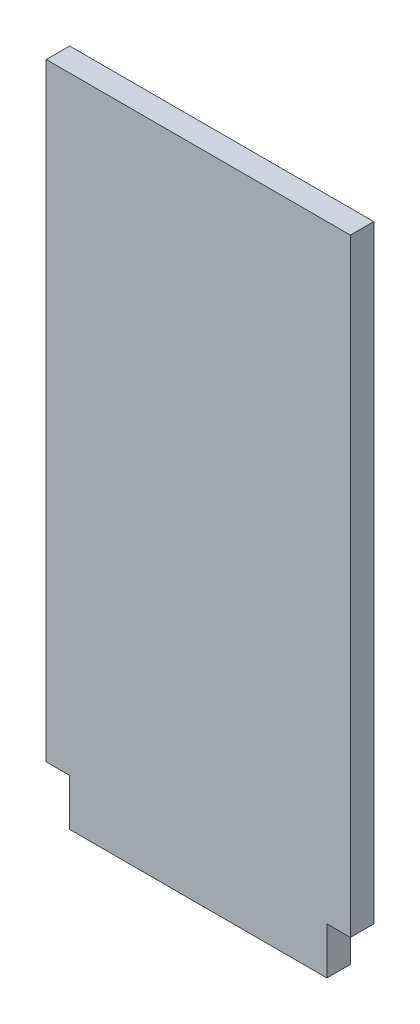
ISO-10303-21;
HEADER;
FILE_DESCRIPTION(('STEP AP214'),'2;1');
FILE_NAME('part.step','',(''),(''),'','','');
FILE_SCHEMA(('AUTOMOTIVE_DESIGN { 1 0 10303 214 1 1 1 1 }'));
ENDSEC;
DATA;
#1=APPLICATION_CONTEXT('core data for automotive mechanical design processes');
#2=APPLICATION_PROTOCOL_DEFINITION('international standard','automotive_design',2000,#1);
#3=PRODUCT_CONTEXT('',#1,'mechanical');
#4=PRODUCT('Part','Part','',(#3));
#5=PRODUCT_RELATED_PRODUCT_CATEGORY('part','',(#4));
#6=PRODUCT_DEFINITION_FORMATION('','',#4);
#7=PRODUCT_DEFINITION_CONTEXT('part definition',#1,'design');
#8=PRODUCT_DEFINITION('design','',#6,#7);
#9=PRODUCT_DEFINITION_SHAPE('','',#8);
#10=(LENGTH_UNIT() NAMED_UNIT(*) SI_UNIT(.MILLI.,.METRE.));
#11=(NAMED_UNIT(*) PLANE_ANGLE_UNIT() SI_UNIT($,.RADIAN.));
#12=(NAMED_UNIT(*) SI_UNIT($,.STERADIAN.) SOLID_ANGLE_UNIT());
#13=UNCERTAINTY_MEASURE_WITH_UNIT(LENGTH_MEASURE(1.E-05),#10,'distance_accuracy_value','');
#14=(GEOMETRIC_REPRESENTATION_CONTEXT(3) GLOBAL_UNCERTAINTY_ASSIGNED_CONTEXT((#13)) GLOBAL_UNIT_ASSIGNED_CONTEXT((#10,
#11,#12)) REPRESENTATION_CONTEXT('',''));
#15=CARTESIAN_POINT('',(0.,0.,0.));
#16=DIRECTION('',(0.,0.,1.));
#17=DIRECTION('',(1.,0.,0.));
#18=AXIS2_PLACEMENT_3D('',#15,#16,#17);
#19=CARTESIAN_POINT('',(-32.5,-60.,5.));
#20=DIRECTION('',(1.,0.,0.));
#21=DIRECTION('',(0.,0.,-1.));
#22=AXIS2_PLACEMENT_3D('',#19,#20,#21);
#23=PLANE('',#22);
#24=DIRECTION('',(0.,-1.,0.));
#25=VECTOR('',#24,1.);
#26=CARTESIAN_POINT('',(-32.5,-60.,0.));
#27=LINE('',#26,#25);
#28=CARTESIAN_POINT('',(-32.5,70.,0.));
#29=VERTEX_POINT('',#28);
#30=CARTESIAN_POINT('',(-32.5,-60.,0.));
#31=VERTEX_POINT('',#30);
#32=EDGE_CURVE('E128',#29,#31,#27,.T.);
#33=ORIENTED_EDGE('',*,*,#32,.T.);
#34=DIRECTION('',(0.,0.,-1.));
#35=VECTOR('',#34,1.);
#36=CARTESIAN_POINT('',(-32.5,-60.,5.));
#37=LINE('',#36,#35);
#38=CARTESIAN_POINT('',(-32.5,-60.,5.));
#39=VERTEX_POINT('',#38);
#40=EDGE_CURVE('E11',#39,#31,#37,.T.);
#41=ORIENTED_EDGE('',*,*,#40,.F.);
#42=DIRECTION('',(0.,-1.,0.));
#43=VECTOR('',#42,1.);
#44=CARTESIAN_POINT('',(-32.5,-60.,5.));
#45=LINE('',#44,#43);
#46=CARTESIAN_POINT('',(-32.5,70.,5.));
#47=VERTEX_POINT('',#46);
#48=EDGE_CURVE('E142',#47,#39,#45,.T.);
#49=ORIENTED_EDGE('',*,*,#48,.F.);
#50=DIRECTION('',(0.,0.,-1.));
#51=VECTOR('',#50,1.);
#52=CARTESIAN_POINT('',(-32.5,70.,5.));
#53=LINE('',#52,#51);
#54=EDGE_CURVE('E124',#47,#29,#53,.T.);
#55=ORIENTED_EDGE('',*,*,#54,.T.);
#56=EDGE_LOOP('',(#33,#41,#49,#55));
#57=FACE_BOUND('',#56,.T.);
#58=ADVANCED_FACE('F32',(#57),#23,.F.);
#59=CARTESIAN_POINT('',(-27.5,-60.,5.));
#60=DIRECTION('',(0.,1.,0.));
#61=DIRECTION('',(0.,0.,1.));
#62=AXIS2_PLACEMENT_3D('',#59,#60,#61);
#63=PLANE('',#62);
#64=DIRECTION('',(1.,0.,0.));
#65=VECTOR('',#64,1.);
#66=CARTESIAN_POINT('',(-27.5,-60.,0.));
#67=LINE('',#66,#65);
#68=CARTESIAN_POINT('',(-27.5,-60.,0.));
#69=VERTEX_POINT('',#68);
#70=EDGE_CURVE('E131',#31,#69,#67,.T.);
#71=ORIENTED_EDGE('',*,*,#70,.T.);
#72=DIRECTION('',(0.,0.,-1.));
#73=VECTOR('',#72,1.);
#74=CARTESIAN_POINT('',(-27.5,-60.,5.));
#75=LINE('',#74,#73);
#76=CARTESIAN_POINT('',(-27.5,-60.,5.));
#77=VERTEX_POINT('',#76);
#78=EDGE_CURVE('E40',#77,#69,#75,.T.);
#79=ORIENTED_EDGE('',*,*,#78,.F.);
#80=DIRECTION('',(1.,0.,0.));
#81=VECTOR('',#80,1.);
#82=CARTESIAN_POINT('',(-27.5,-60.,5.));
#83=LINE('',#82,#81);
#84=EDGE_CURVE('E91',#39,#77,#83,.T.);
#85=ORIENTED_EDGE('',*,*,#84,.F.);
#86=ORIENTED_EDGE('',*,*,#40,.T.);
#87=EDGE_LOOP('',(#71,#79,#85,#86));
#88=FACE_BOUND('',#87,.T.);
#89=ADVANCED_FACE('F177',(#88),#63,.F.);
#90=CARTESIAN_POINT('',(-27.5,-70.,5.));
#91=DIRECTION('',(1.,0.,0.));
#92=DIRECTION('',(0.,0.,-1.));
#93=AXIS2_PLACEMENT_3D('',#90,#91,#92);
#94=PLANE('',#93);
#95=DIRECTION('',(0.,-1.,0.));
#96=VECTOR('',#95,1.);
#97=CARTESIAN_POINT('',(-27.5,-70.,0.));
#98=LINE('',#97,#96);
#99=CARTESIAN_POINT('',(-27.5,-70.,0.));
#100=VERTEX_POINT('',#99);
#101=EDGE_CURVE('E133',#69,#100,#98,.T.);
#102=ORIENTED_EDGE('',*,*,#101,.T.);
#103=DIRECTION('',(0.,0.,-1.));
#104=VECTOR('',#103,1.);
#105=CARTESIAN_POINT('',(-27.5,-70.,5.));
#106=LINE('',#105,#104);
#107=CARTESIAN_POINT('',(-27.5,-70.,5.));
#108=VERTEX_POINT('',#107);
#109=EDGE_CURVE('E149',#108,#100,#106,.T.);
#110=ORIENTED_EDGE('',*,*,#109,.F.);
#111=DIRECTION('',(0.,-1.,0.));
#112=VECTOR('',#111,1.);
#113=CARTESIAN_POINT('',(-27.5,-70.,5.));
#114=LINE('',#113,#112);
#115=EDGE_CURVE('E157',#77,#108,#114,.T.);
#116=ORIENTED_EDGE('',*,*,#115,.F.);
#117=ORIENTED_EDGE('',*,*,#78,.T.);
#118=EDGE_LOOP('',(#102,#110,#116,#117));
#119=FACE_BOUND('',#118,.T.);
#120=ADVANCED_FACE('F155',(#119),#94,.F.);
#121=CARTESIAN_POINT('',(27.5,-70.,5.));
#122=DIRECTION('',(0.,1.,0.));
#123=DIRECTION('',(-1.,0.,0.));
#124=AXIS2_PLACEMENT_3D('',#121,#122,#123);
#125=PLANE('',#124);
#126=DIRECTION('',(1.,0.,0.));
#127=VECTOR('',#126,1.);
#128=CARTESIAN_POINT('',(27.5,-70.,0.));
#129=LINE('',#128,#127);
#130=CARTESIAN_POINT('',(27.5,-70.,0.));
#131=VERTEX_POINT('',#130);
#132=EDGE_CURVE('E135',#100,#131,#129,.T.);
#133=ORIENTED_EDGE('',*,*,#132,.T.);
#134=DIRECTION('',(0.,0.,-1.));
#135=VECTOR('',#134,1.);
#136=CARTESIAN_POINT('',(27.5,-70.,5.));
#137=LINE('',#136,#135);
#138=CARTESIAN_POINT('',(27.5,-70.,5.));
#139=VERTEX_POINT('',#138);
#140=EDGE_CURVE('E146',#139,#131,#137,.T.);
#141=ORIENTED_EDGE('',*,*,#140,.F.);
#142=DIRECTION('',(1.,0.,0.));
#143=VECTOR('',#142,1.);
#144=CARTESIAN_POINT('',(27.5,-70.,5.));
#145=LINE('',#144,#143);
#146=EDGE_CURVE('E169',#108,#139,#145,.T.);
#147=ORIENTED_EDGE('',*,*,#146,.F.);
#148=ORIENTED_EDGE('',*,*,#109,.T.);
#149=EDGE_LOOP('',(#133,#141,#147,#148));
#150=FACE_BOUND('',#149,.T.);
#151=ADVANCED_FACE('F165',(#150),#125,.F.);
#152=CARTESIAN_POINT('',(27.5,-70.,5.));
#153=DIRECTION('',(-1.,0.,0.));
#154=DIRECTION('',(0.,-1.,0.));
#155=AXIS2_PLACEMENT_3D('',#152,#153,#154);
#156=PLANE('',#155);
#157=DIRECTION('',(0.,1.,0.));
#158=VECTOR('',#157,1.);
#159=CARTESIAN_POINT('',(27.5,-70.,0.));
#160=LINE('',#159,#158);
#161=CARTESIAN_POINT('',(27.5,-60.,0.));
#162=VERTEX_POINT('',#161);
#163=EDGE_CURVE('E137',#131,#162,#160,.T.);
#164=ORIENTED_EDGE('',*,*,#163,.T.);
#165=DIRECTION('',(0.,0.,-1.));
#166=VECTOR('',#165,1.);
#167=CARTESIAN_POINT('',(27.5,-60.,5.));
#168=LINE('',#167,#166);
#169=CARTESIAN_POINT('',(27.5,-60.,5.));
#170=VERTEX_POINT('',#169);
#171=EDGE_CURVE('E119',#170,#162,#168,.T.);
#172=ORIENTED_EDGE('',*,*,#171,.F.);
#173=DIRECTION('',(0.,1.,0.));
#174=VECTOR('',#173,1.);
#175=CARTESIAN_POINT('',(27.5,-70.,5.));
#176=LINE('',#175,#174);
#177=EDGE_CURVE('E110',#139,#170,#176,.T.);
#178=ORIENTED_EDGE('',*,*,#177,.F.);
#179=ORIENTED_EDGE('',*,*,#140,.T.);
#180=EDGE_LOOP('',(#164,#172,#178,#179));
#181=FACE_BOUND('',#180,.T.);
#182=ADVANCED_FACE('F168',(#181),#156,.F.);
#183=CARTESIAN_POINT('',(27.5,-60.,5.));
#184=DIRECTION('',(0.,1.,0.));
#185=DIRECTION('',(-1.,0.,0.));
#186=AXIS2_PLACEMENT_3D('',#183,#184,#185);
#187=PLANE('',#186);
#188=DIRECTION('',(1.,0.,0.));
#189=VECTOR('',#188,1.);
#190=CARTESIAN_POINT('',(27.5,-60.,0.));
#191=LINE('',#190,#189);
#192=CARTESIAN_POINT('',(32.5,-60.,0.));
#193=VERTEX_POINT('',#192);
#194=EDGE_CURVE('E118',#162,#193,#191,.T.);
#195=ORIENTED_EDGE('',*,*,#194,.T.);
#196=DIRECTION('',(0.,0.,-1.));
#197=VECTOR('',#196,1.);
#198=CARTESIAN_POINT('',(32.5,-60.,5.));
#199=LINE('',#198,#197);
#200=CARTESIAN_POINT('',(32.5,-60.,5.));
#201=VERTEX_POINT('',#200);
#202=EDGE_CURVE('E115',#201,#193,#199,.T.);
#203=ORIENTED_EDGE('',*,*,#202,.F.);
#204=DIRECTION('',(1.,0.,0.));
#205=VECTOR('',#204,1.);
#206=CARTESIAN_POINT('',(27.5,-60.,5.));
#207=LINE('',#206,#205);
#208=EDGE_CURVE('E104',#170,#201,#207,.T.);
#209=ORIENTED_EDGE('',*,*,#208,.F.);
#210=ORIENTED_EDGE('',*,*,#171,.T.);
#211=EDGE_LOOP('',(#195,#203,#209,#210));
#212=FACE_BOUND('',#211,.T.);
#213=ADVANCED_FACE('F116',(#212),#187,.F.);
#214=CARTESIAN_POINT('',(32.5,-60.,5.));
#215=DIRECTION('',(-1.,0.,0.));
#216=DIRECTION('',(0.,0.,1.));
#217=AXIS2_PLACEMENT_3D('',#214,#215,#216);
#218=PLANE('',#217);
#219=DIRECTION('',(0.,1.,0.));
#220=VECTOR('',#219,1.);
#221=CARTESIAN_POINT('',(32.5,-60.,0.));
#222=LINE('',#221,#220);
#223=CARTESIAN_POINT('',(32.5,70.,0.));
#224=VERTEX_POINT('',#223);
#225=EDGE_CURVE('E77',#193,#224,#222,.T.);
#226=ORIENTED_EDGE('',*,*,#225,.T.);
#227=DIRECTION('',(0.,0.,-1.));
#228=VECTOR('',#227,1.);
#229=CARTESIAN_POINT('',(32.5,70.,5.));
#230=LINE('',#229,#228);
#231=CARTESIAN_POINT('',(32.5,70.,5.));
#232=VERTEX_POINT('',#231);
#233=EDGE_CURVE('E120',#232,#224,#230,.T.);
#234=ORIENTED_EDGE('',*,*,#233,.F.);
#235=DIRECTION('',(0.,1.,0.));
#236=VECTOR('',#235,1.);
#237=CARTESIAN_POINT('',(32.5,-60.,5.));
#238=LINE('',#237,#236);
#239=EDGE_CURVE('E108',#201,#232,#238,.T.);
#240=ORIENTED_EDGE('',*,*,#239,.F.);
#241=ORIENTED_EDGE('',*,*,#202,.T.);
#242=EDGE_LOOP('',(#226,#234,#240,#241));
#243=FACE_BOUND('',#242,.T.);
#244=ADVANCED_FACE('F122',(#243),#218,.F.);
#245=CARTESIAN_POINT('',(32.5,70.,5.));
#246=DIRECTION('',(0.,-1.,0.));
#247=DIRECTION('',(0.,0.,-1.));
#248=AXIS2_PLACEMENT_3D('',#245,#246,#247);
#249=PLANE('',#248);
#250=DIRECTION('',(-1.,0.,0.));
#251=VECTOR('',#250,1.);
#252=CARTESIAN_POINT('',(32.5,70.,0.));
#253=LINE('',#252,#251);
#254=EDGE_CURVE('E83',#224,#29,#253,.T.);
#255=ORIENTED_EDGE('',*,*,#254,.T.);
#256=ORIENTED_EDGE('',*,*,#54,.F.);
#257=DIRECTION('',(-1.,0.,0.));
#258=VECTOR('',#257,1.);
#259=CARTESIAN_POINT('',(32.5,70.,5.));
#260=LINE('',#259,#258);
#261=EDGE_CURVE('E48',#232,#47,#260,.T.);
#262=ORIENTED_EDGE('',*,*,#261,.F.);
#263=ORIENTED_EDGE('',*,*,#233,.T.);
#264=EDGE_LOOP('',(#255,#256,#262,#263));
#265=FACE_BOUND('',#264,.T.);
#266=ADVANCED_FACE('F193',(#265),#249,.F.);
#267=CARTESIAN_POINT('',(0.,0.,5.));
#268=DIRECTION('',(0.,0.,1.));
#269=DIRECTION('',(1.,0.,0.));
#270=AXIS2_PLACEMENT_3D('',#267,#268,#269);
#271=PLANE('',#270);
#272=ORIENTED_EDGE('',*,*,#48,.T.);
#273=ORIENTED_EDGE('',*,*,#84,.T.);
#274=ORIENTED_EDGE('',*,*,#115,.T.);
#275=ORIENTED_EDGE('',*,*,#146,.T.);
#276=ORIENTED_EDGE('',*,*,#177,.T.);
#277=ORIENTED_EDGE('',*,*,#208,.T.);
#278=ORIENTED_EDGE('',*,*,#239,.T.);
#279=ORIENTED_EDGE('',*,*,#261,.T.);
#280=EDGE_LOOP('',(#272,#273,#274,#275,#276,#277,#278,#279));
#281=FACE_BOUND('',#280,.T.);
#282=ADVANCED_FACE('F106',(#281),#271,.T.);
#283=CARTESIAN_POINT('',(0.,0.,0.));
#284=DIRECTION('',(0.,0.,1.));
#285=DIRECTION('',(1.,0.,0.));
#286=AXIS2_PLACEMENT_3D('',#283,#284,#285);
#287=PLANE('',#286);
#288=ORIENTED_EDGE('',*,*,#32,.F.);
#289=ORIENTED_EDGE('',*,*,#254,.F.);
#290=ORIENTED_EDGE('',*,*,#225,.F.);
#291=ORIENTED_EDGE('',*,*,#194,.F.);
#292=ORIENTED_EDGE('',*,*,#163,.F.);
#293=ORIENTED_EDGE('',*,*,#132,.F.);
#294=ORIENTED_EDGE('',*,*,#101,.F.);
#295=ORIENTED_EDGE('',*,*,#70,.F.);
#296=EDGE_LOOP('',(#288,#289,#290,#291,#292,#293,#294,#295));
#297=FACE_BOUND('',#296,.T.);
#298=ADVANCED_FACE('F161',(#297),#287,.F.);
#299=CLOSED_SHELL('',(#58,#89,#120,#151,#182,#213,#244,#266,#282,#298));
#300=MANIFOLD_SOLID_BREP('B2',#299);
#301=ADVANCED_BREP_SHAPE_REPRESENTATION('',(#18,#300),#14);
#302=SHAPE_DEFINITION_REPRESENTATION(#9,#301);
ENDSEC;
END-ISO-10303-21;
